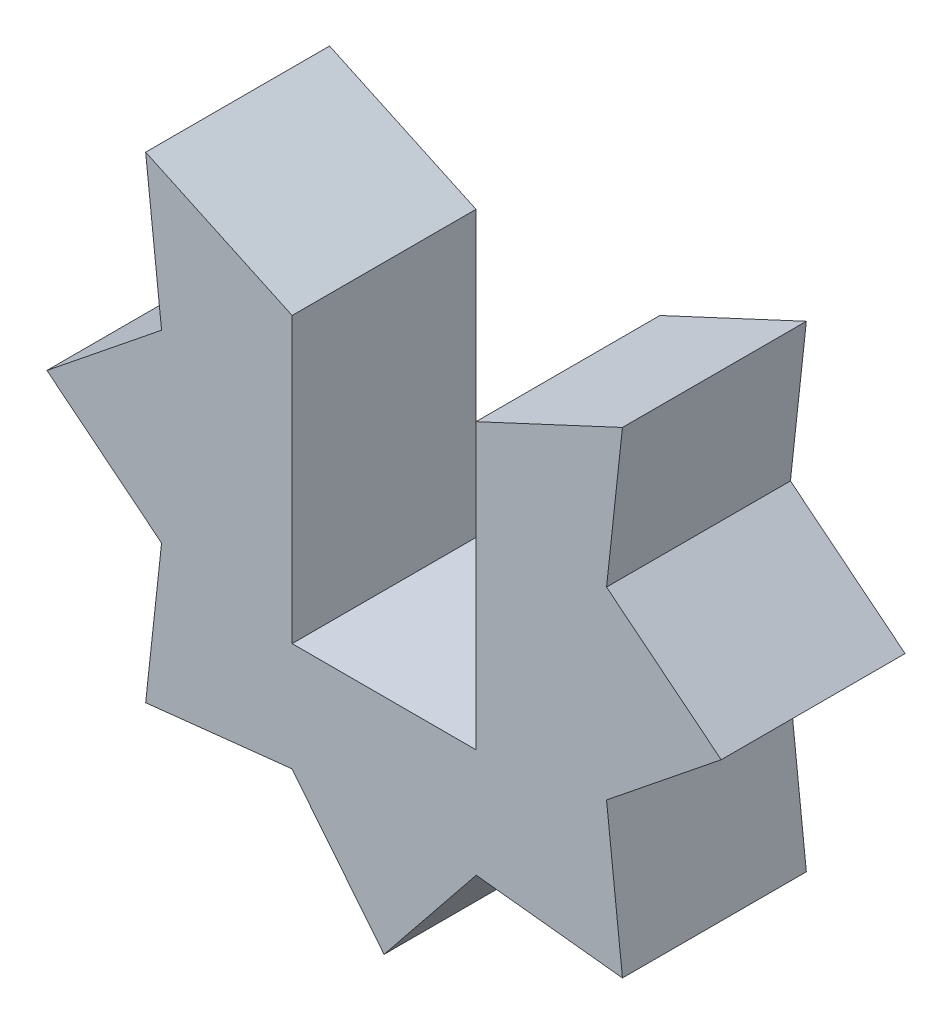
ISO-10303-21;
HEADER;
FILE_DESCRIPTION(('STEP AP214'),'2;1');
FILE_NAME('part.step','',(''),(''),'','','');
FILE_SCHEMA(('AUTOMOTIVE_DESIGN { 1 0 10303 214 1 1 1 1 }'));
ENDSEC;
DATA;
#1=APPLICATION_CONTEXT('core data for automotive mechanical design processes');
#2=APPLICATION_PROTOCOL_DEFINITION('international standard','automotive_design',2000,#1);
#3=PRODUCT_CONTEXT('',#1,'mechanical');
#4=PRODUCT('Part','Part','',(#3));
#5=PRODUCT_RELATED_PRODUCT_CATEGORY('part','',(#4));
#6=PRODUCT_DEFINITION_FORMATION('','',#4);
#7=PRODUCT_DEFINITION_CONTEXT('part definition',#1,'design');
#8=PRODUCT_DEFINITION('design','',#6,#7);
#9=PRODUCT_DEFINITION_SHAPE('','',#8);
#10=(LENGTH_UNIT() NAMED_UNIT(*) SI_UNIT(.MILLI.,.METRE.));
#11=(NAMED_UNIT(*) PLANE_ANGLE_UNIT() SI_UNIT($,.RADIAN.));
#12=(NAMED_UNIT(*) SI_UNIT($,.STERADIAN.) SOLID_ANGLE_UNIT());
#13=UNCERTAINTY_MEASURE_WITH_UNIT(LENGTH_MEASURE(1.E-05),#10,'distance_accuracy_value','');
#14=(GEOMETRIC_REPRESENTATION_CONTEXT(3) GLOBAL_UNCERTAINTY_ASSIGNED_CONTEXT((#13)) GLOBAL_UNIT_ASSIGNED_CONTEXT((#10,
#11,#12)) REPRESENTATION_CONTEXT('',''));
#15=CARTESIAN_POINT('',(0.,0.,0.));
#16=DIRECTION('',(0.,0.,1.));
#17=DIRECTION('',(1.,0.,0.));
#18=AXIS2_PLACEMENT_3D('',#15,#16,#17);
#19=CARTESIAN_POINT('',(1.59041789866218,3.41472159803413,6.));
#20=DIRECTION('',(-0.422205456351357,-0.906500166920637,0.));
#21=DIRECTION('',(0.906500166920637,-0.422205456351357,0.));
#22=AXIS2_PLACEMENT_3D('',#19,#20,#21);
#23=PLANE('',#22);
#24=DIRECTION('',(-0.906500166920637,0.422205456351357,0.));
#25=VECTOR('',#24,1.);
#26=CARTESIAN_POINT('',(1.59041789866218,3.41472159803413,0.));
#27=LINE('',#26,#25);
#28=CARTESIAN_POINT('',(-2.99999999999999,5.55272394427945,0.));
#29=VERTEX_POINT('',#28);
#30=CARTESIAN_POINT('',(-7.77817459305201,7.77817459305203,0.));
#31=VERTEX_POINT('',#30);
#32=EDGE_CURVE('E193',#29,#31,#27,.T.);
#33=ORIENTED_EDGE('',*,*,#32,.T.);
#34=DIRECTION('',(0.,0.,-1.));
#35=VECTOR('',#34,1.);
#36=CARTESIAN_POINT('',(-7.77817459305201,7.77817459305203,6.));
#37=LINE('',#36,#35);
#38=CARTESIAN_POINT('',(-7.77817459305201,7.77817459305203,6.));
#39=VERTEX_POINT('',#38);
#40=EDGE_CURVE('E42',#39,#31,#37,.T.);
#41=ORIENTED_EDGE('',*,*,#40,.F.);
#42=DIRECTION('',(-0.906500166920637,0.422205456351357,0.));
#43=VECTOR('',#42,1.);
#44=CARTESIAN_POINT('',(1.59041789866218,3.41472159803413,6.));
#45=LINE('',#44,#43);
#46=CARTESIAN_POINT('',(-2.99999999999999,5.55272394427945,6.));
#47=VERTEX_POINT('',#46);
#48=EDGE_CURVE('E227',#47,#39,#45,.T.);
#49=ORIENTED_EDGE('',*,*,#48,.F.);
#50=DIRECTION('',(0.,0.,-1.));
#51=VECTOR('',#50,1.);
#52=CARTESIAN_POINT('',(-2.99999999999999,5.55272394427945,6.));
#53=LINE('',#52,#51);
#54=EDGE_CURVE('E56',#47,#29,#53,.T.);
#55=ORIENTED_EDGE('',*,*,#54,.T.);
#56=EDGE_LOOP('',(#33,#41,#49,#55));
#57=FACE_BOUND('',#56,.T.);
#58=ADVANCED_FACE('F35',(#57),#23,.F.);
#59=CARTESIAN_POINT('',(-6.85074936114327,-0.74540920417468,6.));
#60=DIRECTION('',(0.994132569927838,0.108168541677662,0.));
#61=DIRECTION('',(-0.108168541677662,0.994132569927838,0.));
#62=AXIS2_PLACEMENT_3D('',#59,#60,#61);
#63=PLANE('',#62);
#64=DIRECTION('',(0.108168541677662,-0.994132569927838,0.));
#65=VECTOR('',#64,1.);
#66=CARTESIAN_POINT('',(-6.85074936114327,-0.74540920417468,0.));
#67=LINE('',#66,#65);
#68=CARTESIAN_POINT('',(-7.25901387489443,3.00678199643575,0.));
#69=VERTEX_POINT('',#68);
#70=EDGE_CURVE('E195',#31,#69,#67,.T.);
#71=ORIENTED_EDGE('',*,*,#70,.T.);
#72=DIRECTION('',(0.,0.,-1.));
#73=VECTOR('',#72,1.);
#74=CARTESIAN_POINT('',(-7.25901387489443,3.00678199643575,6.));
#75=LINE('',#74,#73);
#76=CARTESIAN_POINT('',(-7.25901387489443,3.00678199643575,6.));
#77=VERTEX_POINT('',#76);
#78=EDGE_CURVE('E261',#77,#69,#75,.T.);
#79=ORIENTED_EDGE('',*,*,#78,.F.);
#80=DIRECTION('',(0.108168541677662,-0.994132569927838,0.));
#81=VECTOR('',#80,1.);
#82=CARTESIAN_POINT('',(-6.85074936114327,-0.74540920417468,6.));
#83=LINE('',#82,#81);
#84=EDGE_CURVE('E119',#39,#77,#83,.T.);
#85=ORIENTED_EDGE('',*,*,#84,.F.);
#86=ORIENTED_EDGE('',*,*,#40,.T.);
#87=EDGE_LOOP('',(#71,#79,#85,#86));
#88=FACE_BOUND('',#87,.T.);
#89=ADVANCED_FACE('F264',(#88),#63,.F.);
#90=CARTESIAN_POINT('',(-4.31712742644301,5.3712952325046,6.));
#91=DIRECTION('',(0.626471172263048,-0.77944459092572,0.));
#92=DIRECTION('',(0.77944459092572,0.626471172263048,0.));
#93=AXIS2_PLACEMENT_3D('',#90,#91,#92);
#94=PLANE('',#93);
#95=DIRECTION('',(-0.77944459092572,-0.626471172263048,0.));
#96=VECTOR('',#95,1.);
#97=CARTESIAN_POINT('',(-4.31712742644301,5.3712952325046,0.));
#98=LINE('',#97,#96);
#99=CARTESIAN_POINT('',(-11.,0.,0.));
#100=VERTEX_POINT('',#99);
#101=EDGE_CURVE('E198',#69,#100,#98,.T.);
#102=ORIENTED_EDGE('',*,*,#101,.T.);
#103=DIRECTION('',(0.,0.,-1.));
#104=VECTOR('',#103,1.);
#105=CARTESIAN_POINT('',(-11.,0.,6.));
#106=LINE('',#105,#104);
#107=CARTESIAN_POINT('',(-11.,0.,6.));
#108=VERTEX_POINT('',#107);
#109=EDGE_CURVE('E258',#108,#100,#106,.T.);
#110=ORIENTED_EDGE('',*,*,#109,.F.);
#111=DIRECTION('',(-0.77944459092572,-0.626471172263048,0.));
#112=VECTOR('',#111,1.);
#113=CARTESIAN_POINT('',(-4.31712742644301,5.3712952325046,6.));
#114=LINE('',#113,#112);
#115=EDGE_CURVE('E291',#77,#108,#114,.T.);
#116=ORIENTED_EDGE('',*,*,#115,.F.);
#117=ORIENTED_EDGE('',*,*,#78,.T.);
#118=EDGE_LOOP('',(#102,#110,#116,#117));
#119=FACE_BOUND('',#118,.T.);
#120=ADVANCED_FACE('F361',(#119),#94,.F.);
#121=CARTESIAN_POINT('',(-4.31729569239107,-5.37133228545426,6.));
#122=DIRECTION('',(0.626483380929619,0.779434778168766,0.));
#123=DIRECTION('',(-0.779434778168766,0.626483380929619,0.));
#124=AXIS2_PLACEMENT_3D('',#121,#122,#123);
#125=PLANE('',#124);
#126=DIRECTION('',(0.779434778168766,-0.626483380929619,0.));
#127=VECTOR('',#126,1.);
#128=CARTESIAN_POINT('',(-4.31729569239107,-5.37133228545426,0.));
#129=LINE('',#128,#127);
#130=CARTESIAN_POINT('',(-7.25906097174781,-3.00684059258585,0.));
#131=VERTEX_POINT('',#130);
#132=EDGE_CURVE('E200',#100,#131,#129,.T.);
#133=ORIENTED_EDGE('',*,*,#132,.T.);
#134=DIRECTION('',(0.,0.,-1.));
#135=VECTOR('',#134,1.);
#136=CARTESIAN_POINT('',(-7.25906097174781,-3.00684059258585,6.));
#137=LINE('',#136,#135);
#138=CARTESIAN_POINT('',(-7.25906097174781,-3.00684059258585,6.));
#139=VERTEX_POINT('',#138);
#140=EDGE_CURVE('E255',#139,#131,#137,.T.);
#141=ORIENTED_EDGE('',*,*,#140,.F.);
#142=DIRECTION('',(0.779434778168766,-0.626483380929619,0.));
#143=VECTOR('',#142,1.);
#144=CARTESIAN_POINT('',(-4.31729569239107,-5.37133228545426,6.));
#145=LINE('',#144,#143);
#146=EDGE_CURVE('E293',#108,#139,#145,.T.);
#147=ORIENTED_EDGE('',*,*,#146,.F.);
#148=ORIENTED_EDGE('',*,*,#109,.T.);
#149=EDGE_LOOP('',(#133,#141,#147,#148));
#150=FACE_BOUND('',#149,.T.);
#151=ADVANCED_FACE('F357',(#150),#125,.F.);
#152=CARTESIAN_POINT('',(-6.85084061420661,0.745340516309142,6.));
#153=DIRECTION('',(0.994133796630102,-0.108157266967224,0.));
#154=DIRECTION('',(0.108157266967224,0.994133796630102,0.));
#155=AXIS2_PLACEMENT_3D('',#152,#153,#154);
#156=PLANE('',#155);
#157=DIRECTION('',(-0.108157266967224,-0.994133796630102,0.));
#158=VECTOR('',#157,1.);
#159=CARTESIAN_POINT('',(-6.85084061420661,0.745340516309142,0.));
#160=LINE('',#159,#158);
#161=CARTESIAN_POINT('',(-7.77816193763456,-7.77818724844889,0.));
#162=VERTEX_POINT('',#161);
#163=EDGE_CURVE('E202',#131,#162,#160,.T.);
#164=ORIENTED_EDGE('',*,*,#163,.T.);
#165=DIRECTION('',(0.,0.,-1.));
#166=VECTOR('',#165,1.);
#167=CARTESIAN_POINT('',(-7.77816193763456,-7.77818724844889,6.));
#168=LINE('',#167,#166);
#169=CARTESIAN_POINT('',(-7.77816193763456,-7.77818724844889,6.));
#170=VERTEX_POINT('',#169);
#171=EDGE_CURVE('E252',#170,#162,#168,.T.);
#172=ORIENTED_EDGE('',*,*,#171,.F.);
#173=DIRECTION('',(-0.108157266967224,-0.994133796630102,0.));
#174=VECTOR('',#173,1.);
#175=CARTESIAN_POINT('',(-6.85084061420661,0.745340516309142,6.));
#176=LINE('',#175,#174);
#177=EDGE_CURVE('E295',#139,#170,#176,.T.);
#178=ORIENTED_EDGE('',*,*,#177,.F.);
#179=ORIENTED_EDGE('',*,*,#140,.T.);
#180=EDGE_LOOP('',(#164,#172,#178,#179));
#181=FACE_BOUND('',#180,.T.);
#182=ADVANCED_FACE('F352',(#181),#156,.F.);
#183=CARTESIAN_POINT('',(0.,0.,6.));
#184=DIRECTION('',(0.,0.,-1.));
#185=DIRECTION('',(-1.,0.,0.));
#186=AXIS2_PLACEMENT_3D('',#183,#184,#185);
#187=CYLINDRICAL_SURFACE('',#186,11.);
#188=CARTESIAN_POINT('',(0.,0.,0.));
#189=DIRECTION('',(0.,0.,1.));
#190=DIRECTION('',(1.,0.,0.));
#191=AXIS2_PLACEMENT_3D('',#188,#189,#190);
#192=CIRCLE('',#191,11.);
#193=CARTESIAN_POINT('',(-7.77811574874394,-7.77823343691493,0.));
#194=VERTEX_POINT('',#193);
#195=EDGE_CURVE('E204',#162,#194,#192,.T.);
#196=ORIENTED_EDGE('',*,*,#195,.T.);
#197=DIRECTION('',(0.,0.,-1.));
#198=VECTOR('',#197,1.);
#199=CARTESIAN_POINT('',(-7.77811574874394,-7.77823343691493,6.));
#200=LINE('',#199,#198);
#201=CARTESIAN_POINT('',(-7.77811574874394,-7.77823343691493,6.));
#202=VERTEX_POINT('',#201);
#203=EDGE_CURVE('E249',#202,#194,#200,.T.);
#204=ORIENTED_EDGE('',*,*,#203,.F.);
#205=CARTESIAN_POINT('',(0.,0.,6.));
#206=DIRECTION('',(0.,0.,1.));
#207=DIRECTION('',(1.,0.,0.));
#208=AXIS2_PLACEMENT_3D('',#205,#206,#207);
#209=CIRCLE('',#208,11.);
#210=EDGE_CURVE('E297',#170,#202,#209,.T.);
#211=ORIENTED_EDGE('',*,*,#210,.F.);
#212=ORIENTED_EDGE('',*,*,#171,.T.);
#213=EDGE_LOOP('',(#196,#204,#211,#212));
#214=FACE_BOUND('',#213,.T.);
#215=ADVANCED_FACE('F347',(#214),#187,.T.);
#216=CARTESIAN_POINT('',(0.745496271442933,-6.85068857635825,6.));
#217=DIRECTION('',(-0.1081819770465,0.994131107974351,0.));
#218=DIRECTION('',(-0.994131107974351,-0.1081819770465,0.));
#219=AXIS2_PLACEMENT_3D('',#216,#217,#218);
#220=PLANE('',#219);
#221=DIRECTION('',(0.994131107974351,0.1081819770465,0.));
#222=VECTOR('',#221,1.);
#223=CARTESIAN_POINT('',(0.745496271442933,-6.85068857635825,0.));
#224=LINE('',#223,#222);
#225=CARTESIAN_POINT('',(-3.00678199643575,-7.25901387489443,0.));
#226=VERTEX_POINT('',#225);
#227=EDGE_CURVE('E206',#194,#226,#224,.T.);
#228=ORIENTED_EDGE('',*,*,#227,.T.);
#229=DIRECTION('',(0.,0.,-1.));
#230=VECTOR('',#229,1.);
#231=CARTESIAN_POINT('',(-3.00678199643575,-7.25901387489443,6.));
#232=LINE('',#231,#230);
#233=CARTESIAN_POINT('',(-3.00678199643575,-7.25901387489443,6.));
#234=VERTEX_POINT('',#233);
#235=EDGE_CURVE('E246',#234,#226,#232,.T.);
#236=ORIENTED_EDGE('',*,*,#235,.F.);
#237=DIRECTION('',(0.994131107974351,0.1081819770465,0.));
#238=VECTOR('',#237,1.);
#239=CARTESIAN_POINT('',(0.745496271442933,-6.85068857635825,6.));
#240=LINE('',#239,#238);
#241=EDGE_CURVE('E299',#202,#234,#240,.T.);
#242=ORIENTED_EDGE('',*,*,#241,.F.);
#243=ORIENTED_EDGE('',*,*,#203,.T.);
#244=EDGE_LOOP('',(#228,#236,#242,#243));
#245=FACE_BOUND('',#244,.T.);
#246=ADVANCED_FACE('F343',(#245),#220,.F.);
#247=CARTESIAN_POINT('',(-5.3712952325046,-4.317127426443,6.));
#248=DIRECTION('',(0.77944459092572,0.626471172263047,0.));
#249=DIRECTION('',(-0.626471172263047,0.77944459092572,0.));
#250=AXIS2_PLACEMENT_3D('',#247,#248,#249);
#251=PLANE('',#250);
#252=DIRECTION('',(0.626471172263047,-0.77944459092572,0.));
#253=VECTOR('',#252,1.);
#254=CARTESIAN_POINT('',(-5.3712952325046,-4.317127426443,0.));
#255=LINE('',#254,#253);
#256=CARTESIAN_POINT('',(0.,-11.,0.));
#257=VERTEX_POINT('',#256);
#258=EDGE_CURVE('E208',#226,#257,#255,.T.);
#259=ORIENTED_EDGE('',*,*,#258,.T.);
#260=DIRECTION('',(0.,0.,-1.));
#261=VECTOR('',#260,1.);
#262=CARTESIAN_POINT('',(0.,-11.,6.));
#263=LINE('',#262,#261);
#264=CARTESIAN_POINT('',(0.,-11.,6.));
#265=VERTEX_POINT('',#264);
#266=EDGE_CURVE('E243',#265,#257,#263,.T.);
#267=ORIENTED_EDGE('',*,*,#266,.F.);
#268=DIRECTION('',(0.626471172263047,-0.77944459092572,0.));
#269=VECTOR('',#268,1.);
#270=CARTESIAN_POINT('',(-5.3712952325046,-4.317127426443,6.));
#271=LINE('',#270,#269);
#272=EDGE_CURVE('E301',#234,#265,#271,.T.);
#273=ORIENTED_EDGE('',*,*,#272,.F.);
#274=ORIENTED_EDGE('',*,*,#235,.T.);
#275=EDGE_LOOP('',(#259,#267,#273,#274));
#276=FACE_BOUND('',#275,.T.);
#277=ADVANCED_FACE('F338',(#276),#251,.F.);
#278=CARTESIAN_POINT('',(5.3712952325046,-4.31712742644301,6.));
#279=DIRECTION('',(-0.77944459092572,0.626471172263048,0.));
#280=DIRECTION('',(-0.626471172263048,-0.77944459092572,0.));
#281=AXIS2_PLACEMENT_3D('',#278,#279,#280);
#282=PLANE('',#281);
#283=DIRECTION('',(0.626471172263048,0.77944459092572,0.));
#284=VECTOR('',#283,1.);
#285=CARTESIAN_POINT('',(5.3712952325046,-4.31712742644301,0.));
#286=LINE('',#285,#284);
#287=CARTESIAN_POINT('',(3.00678199643575,-7.25901387489443,0.));
#288=VERTEX_POINT('',#287);
#289=EDGE_CURVE('E210',#257,#288,#286,.T.);
#290=ORIENTED_EDGE('',*,*,#289,.T.);
#291=DIRECTION('',(0.,0.,-1.));
#292=VECTOR('',#291,1.);
#293=CARTESIAN_POINT('',(3.00678199643575,-7.25901387489443,6.));
#294=LINE('',#293,#292);
#295=CARTESIAN_POINT('',(3.00678199643575,-7.25901387489443,6.));
#296=VERTEX_POINT('',#295);
#297=EDGE_CURVE('E240',#296,#288,#294,.T.);
#298=ORIENTED_EDGE('',*,*,#297,.F.);
#299=DIRECTION('',(0.626471172263048,0.77944459092572,0.));
#300=VECTOR('',#299,1.);
#301=CARTESIAN_POINT('',(5.3712952325046,-4.31712742644301,6.));
#302=LINE('',#301,#300);
#303=EDGE_CURVE('E303',#265,#296,#302,.T.);
#304=ORIENTED_EDGE('',*,*,#303,.F.);
#305=ORIENTED_EDGE('',*,*,#266,.T.);
#306=EDGE_LOOP('',(#290,#298,#304,#305));
#307=FACE_BOUND('',#306,.T.);
#308=ADVANCED_FACE('F332',(#307),#282,.F.);
#309=CARTESIAN_POINT('',(-0.745409204174707,-6.85074936114325,6.));
#310=DIRECTION('',(0.108168541677666,0.994132569927838,0.));
#311=DIRECTION('',(-0.994132569927838,0.108168541677666,0.));
#312=AXIS2_PLACEMENT_3D('',#309,#310,#311);
#313=PLANE('',#312);
#314=DIRECTION('',(0.994132569927838,-0.108168541677666,0.));
#315=VECTOR('',#314,1.);
#316=CARTESIAN_POINT('',(-0.745409204174707,-6.85074936114325,0.));
#317=LINE('',#316,#315);
#318=CARTESIAN_POINT('',(7.77817459305203,-7.77817459305203,0.));
#319=VERTEX_POINT('',#318);
#320=EDGE_CURVE('E212',#288,#319,#317,.T.);
#321=ORIENTED_EDGE('',*,*,#320,.T.);
#322=DIRECTION('',(0.,0.,-1.));
#323=VECTOR('',#322,1.);
#324=CARTESIAN_POINT('',(7.77817459305203,-7.77817459305203,6.));
#325=LINE('',#324,#323);
#326=CARTESIAN_POINT('',(7.77817459305203,-7.77817459305203,6.));
#327=VERTEX_POINT('',#326);
#328=EDGE_CURVE('E237',#327,#319,#325,.T.);
#329=ORIENTED_EDGE('',*,*,#328,.F.);
#330=DIRECTION('',(0.994132569927838,-0.108168541677666,0.));
#331=VECTOR('',#330,1.);
#332=CARTESIAN_POINT('',(-0.745409204174707,-6.85074936114325,6.));
#333=LINE('',#332,#331);
#334=EDGE_CURVE('E305',#296,#327,#333,.T.);
#335=ORIENTED_EDGE('',*,*,#334,.F.);
#336=ORIENTED_EDGE('',*,*,#297,.T.);
#337=EDGE_LOOP('',(#321,#329,#335,#336));
#338=FACE_BOUND('',#337,.T.);
#339=ADVANCED_FACE('F328',(#338),#313,.F.);
#340=CARTESIAN_POINT('',(6.85074936114324,0.745409204174715,6.));
#341=DIRECTION('',(-0.994132569927837,-0.108168541677667,0.));
#342=DIRECTION('',(0.108168541677667,-0.994132569927838,0.));
#343=AXIS2_PLACEMENT_3D('',#340,#341,#342);
#344=PLANE('',#343);
#345=DIRECTION('',(-0.108168541677667,0.994132569927838,0.));
#346=VECTOR('',#345,1.);
#347=CARTESIAN_POINT('',(6.85074936114324,0.745409204174715,0.));
#348=LINE('',#347,#346);
#349=CARTESIAN_POINT('',(7.25901387489443,-3.00678199643575,0.));
#350=VERTEX_POINT('',#349);
#351=EDGE_CURVE('E214',#319,#350,#348,.T.);
#352=ORIENTED_EDGE('',*,*,#351,.T.);
#353=DIRECTION('',(0.,0.,-1.));
#354=VECTOR('',#353,1.);
#355=CARTESIAN_POINT('',(7.25901387489443,-3.00678199643575,6.));
#356=LINE('',#355,#354);
#357=CARTESIAN_POINT('',(7.25901387489443,-3.00678199643575,6.));
#358=VERTEX_POINT('',#357);
#359=EDGE_CURVE('E234',#358,#350,#356,.T.);
#360=ORIENTED_EDGE('',*,*,#359,.F.);
#361=DIRECTION('',(-0.108168541677667,0.994132569927838,0.));
#362=VECTOR('',#361,1.);
#363=CARTESIAN_POINT('',(6.85074936114324,0.745409204174715,6.));
#364=LINE('',#363,#362);
#365=EDGE_CURVE('E307',#327,#358,#364,.T.);
#366=ORIENTED_EDGE('',*,*,#365,.F.);
#367=ORIENTED_EDGE('',*,*,#328,.T.);
#368=EDGE_LOOP('',(#352,#360,#366,#367));
#369=FACE_BOUND('',#368,.T.);
#370=ADVANCED_FACE('F324',(#369),#344,.F.);
#371=CARTESIAN_POINT('',(4.31712742644301,-5.3712952325046,6.));
#372=DIRECTION('',(-0.626471172263048,0.77944459092572,0.));
#373=DIRECTION('',(-0.77944459092572,-0.626471172263048,0.));
#374=AXIS2_PLACEMENT_3D('',#371,#372,#373);
#375=PLANE('',#374);
#376=DIRECTION('',(0.77944459092572,0.626471172263048,0.));
#377=VECTOR('',#376,1.);
#378=CARTESIAN_POINT('',(4.31712742644301,-5.3712952325046,0.));
#379=LINE('',#378,#377);
#380=CARTESIAN_POINT('',(11.,0.,0.));
#381=VERTEX_POINT('',#380);
#382=EDGE_CURVE('E216',#350,#381,#379,.T.);
#383=ORIENTED_EDGE('',*,*,#382,.T.);
#384=DIRECTION('',(0.,0.,-1.));
#385=VECTOR('',#384,1.);
#386=CARTESIAN_POINT('',(11.,0.,6.));
#387=LINE('',#386,#385);
#388=CARTESIAN_POINT('',(11.,0.,6.));
#389=VERTEX_POINT('',#388);
#390=EDGE_CURVE('E231',#389,#381,#387,.T.);
#391=ORIENTED_EDGE('',*,*,#390,.F.);
#392=DIRECTION('',(0.77944459092572,0.626471172263048,0.));
#393=VECTOR('',#392,1.);
#394=CARTESIAN_POINT('',(4.31712742644301,-5.3712952325046,6.));
#395=LINE('',#394,#393);
#396=EDGE_CURVE('E309',#358,#389,#395,.T.);
#397=ORIENTED_EDGE('',*,*,#396,.F.);
#398=ORIENTED_EDGE('',*,*,#359,.T.);
#399=EDGE_LOOP('',(#383,#391,#397,#398));
#400=FACE_BOUND('',#399,.T.);
#401=ADVANCED_FACE('F315',(#400),#375,.F.);
#402=CARTESIAN_POINT('',(4.317127426443,5.3712952325046,6.));
#403=DIRECTION('',(-0.626471172263047,-0.77944459092572,0.));
#404=DIRECTION('',(0.77944459092572,-0.626471172263047,0.));
#405=AXIS2_PLACEMENT_3D('',#402,#403,#404);
#406=PLANE('',#405);
#407=DIRECTION('',(-0.77944459092572,0.626471172263047,0.));
#408=VECTOR('',#407,1.);
#409=CARTESIAN_POINT('',(4.317127426443,5.3712952325046,0.));
#410=LINE('',#409,#408);
#411=CARTESIAN_POINT('',(7.25901387489443,3.00678199643575,0.));
#412=VERTEX_POINT('',#411);
#413=EDGE_CURVE('E218',#381,#412,#410,.T.);
#414=ORIENTED_EDGE('',*,*,#413,.T.);
#415=DIRECTION('',(0.,0.,-1.));
#416=VECTOR('',#415,1.);
#417=CARTESIAN_POINT('',(7.25901387489443,3.00678199643575,6.));
#418=LINE('',#417,#416);
#419=CARTESIAN_POINT('',(7.25901387489443,3.00678199643575,6.));
#420=VERTEX_POINT('',#419);
#421=EDGE_CURVE('E181',#420,#412,#418,.T.);
#422=ORIENTED_EDGE('',*,*,#421,.F.);
#423=DIRECTION('',(-0.77944459092572,0.626471172263047,0.));
#424=VECTOR('',#423,1.);
#425=CARTESIAN_POINT('',(4.317127426443,5.3712952325046,6.));
#426=LINE('',#425,#424);
#427=EDGE_CURVE('E168',#389,#420,#426,.T.);
#428=ORIENTED_EDGE('',*,*,#427,.F.);
#429=ORIENTED_EDGE('',*,*,#390,.T.);
#430=EDGE_LOOP('',(#414,#422,#428,#429));
#431=FACE_BOUND('',#430,.T.);
#432=ADVANCED_FACE('F319',(#431),#406,.F.);
#433=CARTESIAN_POINT('',(6.85074936114326,-0.745409204174684,6.));
#434=DIRECTION('',(-0.994132569927838,0.108168541677662,0.));
#435=DIRECTION('',(-0.108168541677662,-0.994132569927838,0.));
#436=AXIS2_PLACEMENT_3D('',#433,#434,#435);
#437=PLANE('',#436);
#438=DIRECTION('',(0.108168541677662,0.994132569927838,0.));
#439=VECTOR('',#438,1.);
#440=CARTESIAN_POINT('',(6.85074936114326,-0.745409204174684,0.));
#441=LINE('',#440,#439);
#442=CARTESIAN_POINT('',(7.77817459305201,7.77817459305203,0.));
#443=VERTEX_POINT('',#442);
#444=EDGE_CURVE('E177',#412,#443,#441,.T.);
#445=ORIENTED_EDGE('',*,*,#444,.T.);
#446=DIRECTION('',(0.,0.,-1.));
#447=VECTOR('',#446,1.);
#448=CARTESIAN_POINT('',(7.77817459305201,7.77817459305203,6.));
#449=LINE('',#448,#447);
#450=CARTESIAN_POINT('',(7.77817459305201,7.77817459305203,6.));
#451=VERTEX_POINT('',#450);
#452=EDGE_CURVE('E174',#451,#443,#449,.T.);
#453=ORIENTED_EDGE('',*,*,#452,.F.);
#454=DIRECTION('',(0.108168541677662,0.994132569927838,0.));
#455=VECTOR('',#454,1.);
#456=CARTESIAN_POINT('',(6.85074936114326,-0.745409204174684,6.));
#457=LINE('',#456,#455);
#458=EDGE_CURVE('E161',#420,#451,#457,.T.);
#459=ORIENTED_EDGE('',*,*,#458,.F.);
#460=ORIENTED_EDGE('',*,*,#421,.T.);
#461=EDGE_LOOP('',(#445,#453,#459,#460));
#462=FACE_BOUND('',#461,.T.);
#463=ADVANCED_FACE('F175',(#462),#437,.F.);
#464=CARTESIAN_POINT('',(-1.59041789866217,3.41472159803416,6.));
#465=DIRECTION('',(-0.422205456351351,0.906500166920639,0.));
#466=DIRECTION('',(-0.906500166920639,-0.422205456351351,0.));
#467=AXIS2_PLACEMENT_3D('',#464,#465,#466);
#468=PLANE('',#467);
#469=DIRECTION('',(0.906500166920639,0.422205456351351,0.));
#470=VECTOR('',#469,1.);
#471=CARTESIAN_POINT('',(-1.59041789866217,3.41472159803416,0.));
#472=LINE('',#471,#470);
#473=CARTESIAN_POINT('',(3.00000000000001,5.55272394427945,0.));
#474=VERTEX_POINT('',#473);
#475=EDGE_CURVE('E221',#474,#443,#472,.T.);
#476=ORIENTED_EDGE('',*,*,#475,.F.);
#477=DIRECTION('',(0.,0.,-1.));
#478=VECTOR('',#477,1.);
#479=CARTESIAN_POINT('',(3.00000000000001,5.55272394427945,6.));
#480=LINE('',#479,#478);
#481=CARTESIAN_POINT('',(3.00000000000001,5.55272394427945,6.));
#482=VERTEX_POINT('',#481);
#483=EDGE_CURVE('E182',#482,#474,#480,.T.);
#484=ORIENTED_EDGE('',*,*,#483,.F.);
#485=DIRECTION('',(0.906500166920639,0.422205456351351,0.));
#486=VECTOR('',#485,1.);
#487=CARTESIAN_POINT('',(-1.59041789866217,3.41472159803416,6.));
#488=LINE('',#487,#486);
#489=EDGE_CURVE('E166',#482,#451,#488,.T.);
#490=ORIENTED_EDGE('',*,*,#489,.T.);
#491=ORIENTED_EDGE('',*,*,#452,.T.);
#492=EDGE_LOOP('',(#476,#484,#490,#491));
#493=FACE_BOUND('',#492,.T.);
#494=ADVANCED_FACE('F184',(#493),#468,.T.);
#495=CARTESIAN_POINT('',(3.00000000000003,0.,6.));
#496=DIRECTION('',(1.,0.,0.));
#497=DIRECTION('',(0.,1.,0.));
#498=AXIS2_PLACEMENT_3D('',#495,#496,#497);
#499=PLANE('',#498);
#500=DIRECTION('',(0.,-1.,0.));
#501=VECTOR('',#500,1.);
#502=CARTESIAN_POINT('',(3.00000000000003,0.,0.));
#503=LINE('',#502,#501);
#504=CARTESIAN_POINT('',(3.00000000000002,-3.71913154025034,0.));
#505=VERTEX_POINT('',#504);
#506=EDGE_CURVE('E223',#474,#505,#503,.T.);
#507=ORIENTED_EDGE('',*,*,#506,.T.);
#508=DIRECTION('',(0.,0.,1.));
#509=VECTOR('',#508,1.);
#510=CARTESIAN_POINT('',(3.00000000000002,-3.71913154025034,-4.));
#511=LINE('',#510,#509);
#512=CARTESIAN_POINT('',(3.00000000000002,-3.71913154025034,6.));
#513=VERTEX_POINT('',#512);
#514=EDGE_CURVE('E196',#505,#513,#511,.T.);
#515=ORIENTED_EDGE('',*,*,#514,.T.);
#516=DIRECTION('',(0.,-1.,0.));
#517=VECTOR('',#516,1.);
#518=CARTESIAN_POINT('',(3.00000000000003,0.,6.));
#519=LINE('',#518,#517);
#520=EDGE_CURVE('E186',#482,#513,#519,.T.);
#521=ORIENTED_EDGE('',*,*,#520,.F.);
#522=ORIENTED_EDGE('',*,*,#483,.T.);
#523=EDGE_LOOP('',(#507,#515,#521,#522));
#524=FACE_BOUND('',#523,.T.);
#525=ADVANCED_FACE('F285',(#524),#499,.F.);
#526=CARTESIAN_POINT('',(-2.99999999999998,0.,6.));
#527=DIRECTION('',(1.,0.,0.));
#528=DIRECTION('',(0.,1.,0.));
#529=AXIS2_PLACEMENT_3D('',#526,#527,#528);
#530=PLANE('',#529);
#531=DIRECTION('',(0.,-1.,0.));
#532=VECTOR('',#531,1.);
#533=CARTESIAN_POINT('',(-2.99999999999998,0.,0.));
#534=LINE('',#533,#532);
#535=CARTESIAN_POINT('',(-2.99999999999998,-3.71913154025034,0.));
#536=VERTEX_POINT('',#535);
#537=EDGE_CURVE('E48',#29,#536,#534,.T.);
#538=ORIENTED_EDGE('',*,*,#537,.F.);
#539=ORIENTED_EDGE('',*,*,#54,.F.);
#540=DIRECTION('',(0.,-1.,0.));
#541=VECTOR('',#540,1.);
#542=CARTESIAN_POINT('',(-2.99999999999998,0.,6.));
#543=LINE('',#542,#541);
#544=CARTESIAN_POINT('',(-2.99999999999998,-3.71913154025034,6.));
#545=VERTEX_POINT('',#544);
#546=EDGE_CURVE('E188',#47,#545,#543,.T.);
#547=ORIENTED_EDGE('',*,*,#546,.T.);
#548=DIRECTION('',(0.,0.,1.));
#549=VECTOR('',#548,1.);
#550=CARTESIAN_POINT('',(-2.99999999999998,-3.71913154025034,-4.));
#551=LINE('',#550,#549);
#552=EDGE_CURVE('E269',#536,#545,#551,.T.);
#553=ORIENTED_EDGE('',*,*,#552,.F.);
#554=EDGE_LOOP('',(#538,#539,#547,#553));
#555=FACE_BOUND('',#554,.T.);
#556=ADVANCED_FACE('F267',(#555),#530,.T.);
#557=CARTESIAN_POINT('',(0.,0.,6.));
#558=DIRECTION('',(0.,0.,1.));
#559=DIRECTION('',(1.,0.,0.));
#560=AXIS2_PLACEMENT_3D('',#557,#558,#559);
#561=PLANE('',#560);
#562=ORIENTED_EDGE('',*,*,#520,.T.);
#563=DIRECTION('',(1.,0.,0.));
#564=VECTOR('',#563,1.);
#565=CARTESIAN_POINT('',(3.00000000000002,-3.71913154025034,6.));
#566=LINE('',#565,#564);
#567=EDGE_CURVE('E276',#545,#513,#566,.T.);
#568=ORIENTED_EDGE('',*,*,#567,.F.);
#569=ORIENTED_EDGE('',*,*,#546,.F.);
#570=ORIENTED_EDGE('',*,*,#48,.T.);
#571=ORIENTED_EDGE('',*,*,#84,.T.);
#572=ORIENTED_EDGE('',*,*,#115,.T.);
#573=ORIENTED_EDGE('',*,*,#146,.T.);
#574=ORIENTED_EDGE('',*,*,#177,.T.);
#575=ORIENTED_EDGE('',*,*,#210,.T.);
#576=ORIENTED_EDGE('',*,*,#241,.T.);
#577=ORIENTED_EDGE('',*,*,#272,.T.);
#578=ORIENTED_EDGE('',*,*,#303,.T.);
#579=ORIENTED_EDGE('',*,*,#334,.T.);
#580=ORIENTED_EDGE('',*,*,#365,.T.);
#581=ORIENTED_EDGE('',*,*,#396,.T.);
#582=ORIENTED_EDGE('',*,*,#427,.T.);
#583=ORIENTED_EDGE('',*,*,#458,.T.);
#584=ORIENTED_EDGE('',*,*,#489,.F.);
#585=EDGE_LOOP('',(#562,#568,#569,#570,#571,#572,#573,#574,#575,#576,#577,#578,#579,#580,#581,
#582,#583,#584));
#586=FACE_BOUND('',#585,.T.);
#587=ADVANCED_FACE('F164',(#586),#561,.T.);
#588=CARTESIAN_POINT('',(0.,0.,0.));
#589=DIRECTION('',(0.,0.,1.));
#590=DIRECTION('',(1.,0.,0.));
#591=AXIS2_PLACEMENT_3D('',#588,#589,#590);
#592=PLANE('',#591);
#593=DIRECTION('',(1.,0.,0.));
#594=VECTOR('',#593,1.);
#595=CARTESIAN_POINT('',(0.,-3.71913154025034,0.));
#596=LINE('',#595,#594);
#597=EDGE_CURVE('E11',#536,#505,#596,.T.);
#598=ORIENTED_EDGE('',*,*,#597,.T.);
#599=ORIENTED_EDGE('',*,*,#506,.F.);
#600=ORIENTED_EDGE('',*,*,#475,.T.);
#601=ORIENTED_EDGE('',*,*,#444,.F.);
#602=ORIENTED_EDGE('',*,*,#413,.F.);
#603=ORIENTED_EDGE('',*,*,#382,.F.);
#604=ORIENTED_EDGE('',*,*,#351,.F.);
#605=ORIENTED_EDGE('',*,*,#320,.F.);
#606=ORIENTED_EDGE('',*,*,#289,.F.);
#607=ORIENTED_EDGE('',*,*,#258,.F.);
#608=ORIENTED_EDGE('',*,*,#227,.F.);
#609=ORIENTED_EDGE('',*,*,#195,.F.);
#610=ORIENTED_EDGE('',*,*,#163,.F.);
#611=ORIENTED_EDGE('',*,*,#132,.F.);
#612=ORIENTED_EDGE('',*,*,#101,.F.);
#613=ORIENTED_EDGE('',*,*,#70,.F.);
#614=ORIENTED_EDGE('',*,*,#32,.F.);
#615=ORIENTED_EDGE('',*,*,#537,.T.);
#616=EDGE_LOOP('',(#598,#599,#600,#601,#602,#603,#604,#605,#606,#607,#608,#609,#610,#611,#612,
#613,#614,#615));
#617=FACE_BOUND('',#616,.T.);
#618=ADVANCED_FACE('F265',(#617),#592,.F.);
#619=CARTESIAN_POINT('',(3.00000000000002,-3.71913154025034,-4.));
#620=DIRECTION('',(0.,-1.,0.));
#621=DIRECTION('',(1.,0.,0.));
#622=AXIS2_PLACEMENT_3D('',#619,#620,#621);
#623=PLANE('',#622);
#624=ORIENTED_EDGE('',*,*,#552,.T.);
#625=ORIENTED_EDGE('',*,*,#567,.T.);
#626=ORIENTED_EDGE('',*,*,#514,.F.);
#627=ORIENTED_EDGE('',*,*,#597,.F.);
#628=EDGE_LOOP('',(#624,#625,#626,#627));
#629=FACE_BOUND('',#628,.T.);
#630=ADVANCED_FACE('F279',(#629),#623,.F.);
#631=CLOSED_SHELL('',(#58,#89,#120,#151,#182,#215,#246,#277,#308,#339,#370,#401,#432,#463,#494,
#525,#556,#587,#618,#630));
#632=MANIFOLD_SOLID_BREP('B2',#631);
#633=ADVANCED_BREP_SHAPE_REPRESENTATION('',(#18,#632),#14);
#634=SHAPE_DEFINITION_REPRESENTATION(#9,#633);
ENDSEC;
END-ISO-10303-21;
